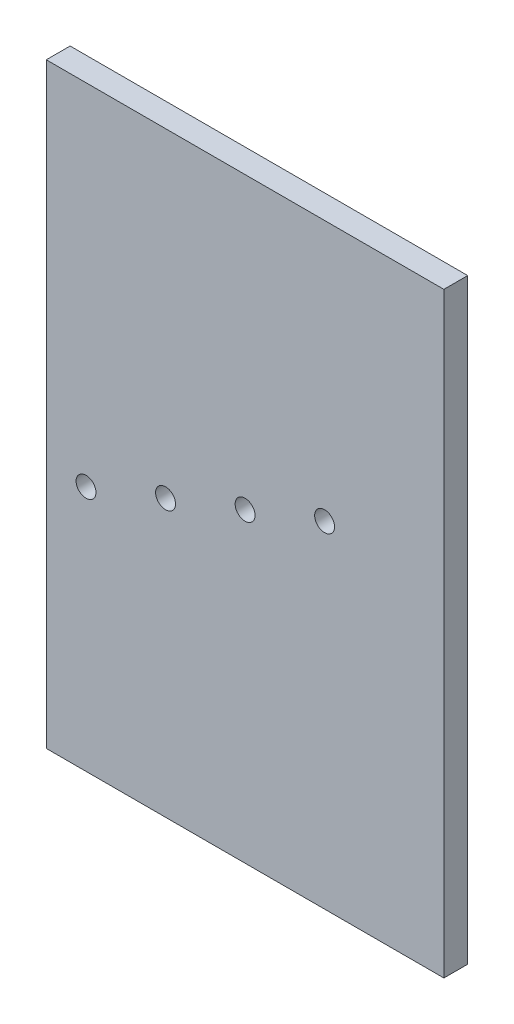
ISO-10303-21;
HEADER;
FILE_DESCRIPTION(('STEP AP214'),'2;1');
FILE_NAME('part.step','',(''),(''),'','','');
FILE_SCHEMA(('AUTOMOTIVE_DESIGN { 1 0 10303 214 1 1 1 1 }'));
ENDSEC;
DATA;
#1=APPLICATION_CONTEXT('core data for automotive mechanical design processes');
#2=APPLICATION_PROTOCOL_DEFINITION('international standard','automotive_design',2000,#1);
#3=PRODUCT_CONTEXT('',#1,'mechanical');
#4=PRODUCT('Part','Part','',(#3));
#5=PRODUCT_RELATED_PRODUCT_CATEGORY('part','',(#4));
#6=PRODUCT_DEFINITION_FORMATION('','',#4);
#7=PRODUCT_DEFINITION_CONTEXT('part definition',#1,'design');
#8=PRODUCT_DEFINITION('design','',#6,#7);
#9=PRODUCT_DEFINITION_SHAPE('','',#8);
#10=(LENGTH_UNIT() NAMED_UNIT(*) SI_UNIT(.MILLI.,.METRE.));
#11=(NAMED_UNIT(*) PLANE_ANGLE_UNIT() SI_UNIT($,.RADIAN.));
#12=(NAMED_UNIT(*) SI_UNIT($,.STERADIAN.) SOLID_ANGLE_UNIT());
#13=UNCERTAINTY_MEASURE_WITH_UNIT(LENGTH_MEASURE(1.E-05),#10,'distance_accuracy_value','');
#14=(GEOMETRIC_REPRESENTATION_CONTEXT(3) GLOBAL_UNCERTAINTY_ASSIGNED_CONTEXT((#13)) GLOBAL_UNIT_ASSIGNED_CONTEXT((#10,
#11,#12)) REPRESENTATION_CONTEXT('',''));
#15=CARTESIAN_POINT('',(0.,0.,0.));
#16=DIRECTION('',(0.,0.,1.));
#17=DIRECTION('',(1.,0.,0.));
#18=AXIS2_PLACEMENT_3D('',#15,#16,#17);
#19=CARTESIAN_POINT('',(0.,0.,6.));
#20=DIRECTION('',(-1.,0.,0.));
#21=DIRECTION('',(0.,0.,1.));
#22=AXIS2_PLACEMENT_3D('',#19,#20,#21);
#23=PLANE('',#22);
#24=DIRECTION('',(0.,1.,0.));
#25=VECTOR('',#24,1.);
#26=CARTESIAN_POINT('',(0.,0.,0.));
#27=LINE('',#26,#25);
#28=CARTESIAN_POINT('',(0.,0.,0.));
#29=VERTEX_POINT('',#28);
#30=CARTESIAN_POINT('',(0.,150.,0.));
#31=VERTEX_POINT('',#30);
#32=EDGE_CURVE('E99',#29,#31,#27,.T.);
#33=ORIENTED_EDGE('',*,*,#32,.T.);
#34=DIRECTION('',(0.,0.,-1.));
#35=VECTOR('',#34,1.);
#36=CARTESIAN_POINT('',(0.,150.,6.));
#37=LINE('',#36,#35);
#38=CARTESIAN_POINT('',(0.,150.,6.));
#39=VERTEX_POINT('',#38);
#40=EDGE_CURVE('E11',#39,#31,#37,.T.);
#41=ORIENTED_EDGE('',*,*,#40,.F.);
#42=DIRECTION('',(0.,1.,0.));
#43=VECTOR('',#42,1.);
#44=CARTESIAN_POINT('',(0.,0.,6.));
#45=LINE('',#44,#43);
#46=CARTESIAN_POINT('',(0.,0.,6.));
#47=VERTEX_POINT('',#46);
#48=EDGE_CURVE('E86',#47,#39,#45,.T.);
#49=ORIENTED_EDGE('',*,*,#48,.F.);
#50=DIRECTION('',(0.,0.,-1.));
#51=VECTOR('',#50,1.);
#52=CARTESIAN_POINT('',(0.,0.,6.));
#53=LINE('',#52,#51);
#54=EDGE_CURVE('E95',#47,#29,#53,.T.);
#55=ORIENTED_EDGE('',*,*,#54,.T.);
#56=EDGE_LOOP('',(#33,#41,#49,#55));
#57=FACE_BOUND('',#56,.T.);
#58=ADVANCED_FACE('F33',(#57),#23,.F.);
#59=CARTESIAN_POINT('',(-100.,150.,6.));
#60=DIRECTION('',(0.,-1.,0.));
#61=DIRECTION('',(1.,0.,0.));
#62=AXIS2_PLACEMENT_3D('',#59,#60,#61);
#63=PLANE('',#62);
#64=DIRECTION('',(-1.,0.,0.));
#65=VECTOR('',#64,1.);
#66=CARTESIAN_POINT('',(-100.,150.,0.));
#67=LINE('',#66,#65);
#68=CARTESIAN_POINT('',(-100.,150.,0.));
#69=VERTEX_POINT('',#68);
#70=EDGE_CURVE('E90',#31,#69,#67,.T.);
#71=ORIENTED_EDGE('',*,*,#70,.T.);
#72=DIRECTION('',(0.,0.,-1.));
#73=VECTOR('',#72,1.);
#74=CARTESIAN_POINT('',(-100.,150.,6.));
#75=LINE('',#74,#73);
#76=CARTESIAN_POINT('',(-100.,150.,6.));
#77=VERTEX_POINT('',#76);
#78=EDGE_CURVE('E42',#77,#69,#75,.T.);
#79=ORIENTED_EDGE('',*,*,#78,.F.);
#80=DIRECTION('',(-1.,0.,0.));
#81=VECTOR('',#80,1.);
#82=CARTESIAN_POINT('',(-100.,150.,6.));
#83=LINE('',#82,#81);
#84=EDGE_CURVE('E81',#39,#77,#83,.T.);
#85=ORIENTED_EDGE('',*,*,#84,.F.);
#86=ORIENTED_EDGE('',*,*,#40,.T.);
#87=EDGE_LOOP('',(#71,#79,#85,#86));
#88=FACE_BOUND('',#87,.T.);
#89=ADVANCED_FACE('F89',(#88),#63,.F.);
#90=CARTESIAN_POINT('',(-100.,0.,6.));
#91=DIRECTION('',(1.,0.,0.));
#92=DIRECTION('',(0.,0.,-1.));
#93=AXIS2_PLACEMENT_3D('',#90,#91,#92);
#94=PLANE('',#93);
#95=DIRECTION('',(0.,-1.,0.));
#96=VECTOR('',#95,1.);
#97=CARTESIAN_POINT('',(-100.,0.,0.));
#98=LINE('',#97,#96);
#99=CARTESIAN_POINT('',(-100.,0.,0.));
#100=VERTEX_POINT('',#99);
#101=EDGE_CURVE('E68',#69,#100,#98,.T.);
#102=ORIENTED_EDGE('',*,*,#101,.T.);
#103=DIRECTION('',(0.,0.,-1.));
#104=VECTOR('',#103,1.);
#105=CARTESIAN_POINT('',(-100.,0.,6.));
#106=LINE('',#105,#104);
#107=CARTESIAN_POINT('',(-100.,0.,6.));
#108=VERTEX_POINT('',#107);
#109=EDGE_CURVE('E91',#108,#100,#106,.T.);
#110=ORIENTED_EDGE('',*,*,#109,.F.);
#111=DIRECTION('',(0.,-1.,0.));
#112=VECTOR('',#111,1.);
#113=CARTESIAN_POINT('',(-100.,0.,6.));
#114=LINE('',#113,#112);
#115=EDGE_CURVE('E84',#77,#108,#114,.T.);
#116=ORIENTED_EDGE('',*,*,#115,.F.);
#117=ORIENTED_EDGE('',*,*,#78,.T.);
#118=EDGE_LOOP('',(#102,#110,#116,#117));
#119=FACE_BOUND('',#118,.T.);
#120=ADVANCED_FACE('F93',(#119),#94,.F.);
#121=CARTESIAN_POINT('',(0.,0.,6.));
#122=DIRECTION('',(0.,1.,0.));
#123=DIRECTION('',(-1.,0.,0.));
#124=AXIS2_PLACEMENT_3D('',#121,#122,#123);
#125=PLANE('',#124);
#126=DIRECTION('',(1.,0.,0.));
#127=VECTOR('',#126,1.);
#128=CARTESIAN_POINT('',(0.,0.,0.));
#129=LINE('',#128,#127);
#130=EDGE_CURVE('E74',#100,#29,#129,.T.);
#131=ORIENTED_EDGE('',*,*,#130,.T.);
#132=ORIENTED_EDGE('',*,*,#54,.F.);
#133=DIRECTION('',(1.,0.,0.));
#134=VECTOR('',#133,1.);
#135=CARTESIAN_POINT('',(0.,0.,6.));
#136=LINE('',#135,#134);
#137=EDGE_CURVE('E51',#108,#47,#136,.T.);
#138=ORIENTED_EDGE('',*,*,#137,.F.);
#139=ORIENTED_EDGE('',*,*,#109,.T.);
#140=EDGE_LOOP('',(#131,#132,#138,#139));
#141=FACE_BOUND('',#140,.T.);
#142=ADVANCED_FACE('F136',(#141),#125,.F.);
#143=CARTESIAN_POINT('',(0.,0.,6.));
#144=DIRECTION('',(0.,0.,-1.));
#145=DIRECTION('',(-1.,0.,0.));
#146=AXIS2_PLACEMENT_3D('',#143,#144,#145);
#147=PLANE('',#146);
#148=CARTESIAN_POINT('',(-50.,77.,6.));
#149=DIRECTION('',(0.,0.,1.));
#150=DIRECTION('',(1.,0.,0.));
#151=AXIS2_PLACEMENT_3D('',#148,#149,#150);
#152=CIRCLE('',#151,2.5);
#153=CARTESIAN_POINT('',(-47.5,77.,6.));
#154=VERTEX_POINT('',#153);
#155=EDGE_CURVE('E126',#154,#154,#152,.T.);
#156=ORIENTED_EDGE('',*,*,#155,.F.);
#157=EDGE_LOOP('',(#156));
#158=FACE_BOUND('',#157,.T.);
#159=CARTESIAN_POINT('',(-30.,84.5,6.));
#160=DIRECTION('',(0.,0.,1.));
#161=DIRECTION('',(1.,0.,0.));
#162=AXIS2_PLACEMENT_3D('',#159,#160,#161);
#163=CIRCLE('',#162,2.5);
#164=CARTESIAN_POINT('',(-27.5,84.5,6.));
#165=VERTEX_POINT('',#164);
#166=EDGE_CURVE('E116',#165,#165,#163,.T.);
#167=ORIENTED_EDGE('',*,*,#166,.F.);
#168=EDGE_LOOP('',(#167));
#169=FACE_BOUND('',#168,.T.);
#170=CARTESIAN_POINT('',(-70.,69.5,6.));
#171=DIRECTION('',(0.,0.,1.));
#172=DIRECTION('',(1.,0.,0.));
#173=AXIS2_PLACEMENT_3D('',#170,#171,#172);
#174=CIRCLE('',#173,2.5);
#175=CARTESIAN_POINT('',(-67.5,69.5,6.));
#176=VERTEX_POINT('',#175);
#177=EDGE_CURVE('E113',#176,#176,#174,.T.);
#178=ORIENTED_EDGE('',*,*,#177,.F.);
#179=EDGE_LOOP('',(#178));
#180=FACE_BOUND('',#179,.T.);
#181=CARTESIAN_POINT('',(-90.,62.,6.));
#182=DIRECTION('',(0.,0.,1.));
#183=DIRECTION('',(1.,0.,0.));
#184=AXIS2_PLACEMENT_3D('',#181,#182,#183);
#185=CIRCLE('',#184,2.5);
#186=CARTESIAN_POINT('',(-87.5,62.,6.));
#187=VERTEX_POINT('',#186);
#188=EDGE_CURVE('E110',#187,#187,#185,.T.);
#189=ORIENTED_EDGE('',*,*,#188,.F.);
#190=EDGE_LOOP('',(#189));
#191=FACE_BOUND('',#190,.T.);
#192=ORIENTED_EDGE('',*,*,#48,.T.);
#193=ORIENTED_EDGE('',*,*,#84,.T.);
#194=ORIENTED_EDGE('',*,*,#115,.T.);
#195=ORIENTED_EDGE('',*,*,#137,.T.);
#196=EDGE_LOOP('',(#192,#193,#194,#195));
#197=FACE_BOUND('',#196,.T.);
#198=ADVANCED_FACE('F82',(#158,#169,#180,#191,#197),#147,.F.);
#199=CARTESIAN_POINT('',(0.,0.,0.));
#200=DIRECTION('',(0.,0.,-1.));
#201=DIRECTION('',(-1.,0.,0.));
#202=AXIS2_PLACEMENT_3D('',#199,#200,#201);
#203=PLANE('',#202);
#204=CARTESIAN_POINT('',(-50.,77.,0.));
#205=DIRECTION('',(0.,0.,-1.));
#206=DIRECTION('',(-1.,0.,0.));
#207=AXIS2_PLACEMENT_3D('',#204,#205,#206);
#208=CIRCLE('',#207,2.5);
#209=CARTESIAN_POINT('',(-52.5,77.,0.));
#210=VERTEX_POINT('',#209);
#211=EDGE_CURVE('E36',#210,#210,#208,.T.);
#212=ORIENTED_EDGE('',*,*,#211,.F.);
#213=EDGE_LOOP('',(#212));
#214=FACE_BOUND('',#213,.T.);
#215=CARTESIAN_POINT('',(-30.,84.5,0.));
#216=DIRECTION('',(0.,0.,-1.));
#217=DIRECTION('',(-1.,0.,0.));
#218=AXIS2_PLACEMENT_3D('',#215,#216,#217);
#219=CIRCLE('',#218,2.5);
#220=CARTESIAN_POINT('',(-32.5,84.5,0.));
#221=VERTEX_POINT('',#220);
#222=EDGE_CURVE('E114',#221,#221,#219,.T.);
#223=ORIENTED_EDGE('',*,*,#222,.F.);
#224=EDGE_LOOP('',(#223));
#225=FACE_BOUND('',#224,.T.);
#226=CARTESIAN_POINT('',(-70.,69.5,0.));
#227=DIRECTION('',(0.,0.,-1.));
#228=DIRECTION('',(-1.,0.,0.));
#229=AXIS2_PLACEMENT_3D('',#226,#227,#228);
#230=CIRCLE('',#229,2.5);
#231=CARTESIAN_POINT('',(-72.5,69.5,0.));
#232=VERTEX_POINT('',#231);
#233=EDGE_CURVE('E111',#232,#232,#230,.T.);
#234=ORIENTED_EDGE('',*,*,#233,.F.);
#235=EDGE_LOOP('',(#234));
#236=FACE_BOUND('',#235,.T.);
#237=CARTESIAN_POINT('',(-90.,62.,0.));
#238=DIRECTION('',(0.,0.,-1.));
#239=DIRECTION('',(-1.,0.,0.));
#240=AXIS2_PLACEMENT_3D('',#237,#238,#239);
#241=CIRCLE('',#240,2.5);
#242=CARTESIAN_POINT('',(-92.5,62.,0.));
#243=VERTEX_POINT('',#242);
#244=EDGE_CURVE('E102',#243,#243,#241,.T.);
#245=ORIENTED_EDGE('',*,*,#244,.F.);
#246=EDGE_LOOP('',(#245));
#247=FACE_BOUND('',#246,.T.);
#248=ORIENTED_EDGE('',*,*,#32,.F.);
#249=ORIENTED_EDGE('',*,*,#130,.F.);
#250=ORIENTED_EDGE('',*,*,#101,.F.);
#251=ORIENTED_EDGE('',*,*,#70,.F.);
#252=EDGE_LOOP('',(#248,#249,#250,#251));
#253=FACE_BOUND('',#252,.T.);
#254=ADVANCED_FACE('F135',(#214,#225,#236,#247,#253),#203,.T.);
#255=CARTESIAN_POINT('',(-90.,62.,-4.));
#256=DIRECTION('',(0.,0.,1.));
#257=DIRECTION('',(1.,0.,0.));
#258=AXIS2_PLACEMENT_3D('',#255,#256,#257);
#259=CYLINDRICAL_SURFACE('',#258,2.5);
#260=ORIENTED_EDGE('',*,*,#244,.T.);
#261=EDGE_LOOP('',(#260));
#262=FACE_BOUND('',#261,.T.);
#263=ORIENTED_EDGE('',*,*,#188,.T.);
#264=EDGE_LOOP('',(#263));
#265=FACE_BOUND('',#264,.T.);
#266=ADVANCED_FACE('F132',(#262,#265),#259,.F.);
#267=CARTESIAN_POINT('',(-70.,69.5,-4.));
#268=DIRECTION('',(0.,0.,1.));
#269=DIRECTION('',(1.,0.,0.));
#270=AXIS2_PLACEMENT_3D('',#267,#268,#269);
#271=CYLINDRICAL_SURFACE('',#270,2.5);
#272=ORIENTED_EDGE('',*,*,#233,.T.);
#273=EDGE_LOOP('',(#272));
#274=FACE_BOUND('',#273,.T.);
#275=ORIENTED_EDGE('',*,*,#177,.T.);
#276=EDGE_LOOP('',(#275));
#277=FACE_BOUND('',#276,.T.);
#278=ADVANCED_FACE('F185',(#274,#277),#271,.F.);
#279=CARTESIAN_POINT('',(-30.,84.5,-4.));
#280=DIRECTION('',(0.,0.,1.));
#281=DIRECTION('',(1.,0.,0.));
#282=AXIS2_PLACEMENT_3D('',#279,#280,#281);
#283=CYLINDRICAL_SURFACE('',#282,2.5);
#284=ORIENTED_EDGE('',*,*,#222,.T.);
#285=EDGE_LOOP('',(#284));
#286=FACE_BOUND('',#285,.T.);
#287=ORIENTED_EDGE('',*,*,#166,.T.);
#288=EDGE_LOOP('',(#287));
#289=FACE_BOUND('',#288,.T.);
#290=ADVANCED_FACE('F194',(#286,#289),#283,.F.);
#291=CARTESIAN_POINT('',(-50.,77.,-4.));
#292=DIRECTION('',(0.,0.,1.));
#293=DIRECTION('',(1.,0.,0.));
#294=AXIS2_PLACEMENT_3D('',#291,#292,#293);
#295=CYLINDRICAL_SURFACE('',#294,2.5);
#296=ORIENTED_EDGE('',*,*,#211,.T.);
#297=EDGE_LOOP('',(#296));
#298=FACE_BOUND('',#297,.T.);
#299=ORIENTED_EDGE('',*,*,#155,.T.);
#300=EDGE_LOOP('',(#299));
#301=FACE_BOUND('',#300,.T.);
#302=ADVANCED_FACE('F204',(#298,#301),#295,.F.);
#303=CLOSED_SHELL('',(#58,#89,#120,#142,#198,#254,#266,#278,#290,#302));
#304=MANIFOLD_SOLID_BREP('B2',#303);
#305=ADVANCED_BREP_SHAPE_REPRESENTATION('',(#18,#304),#14);
#306=SHAPE_DEFINITION_REPRESENTATION(#9,#305);
ENDSEC;
END-ISO-10303-21;
